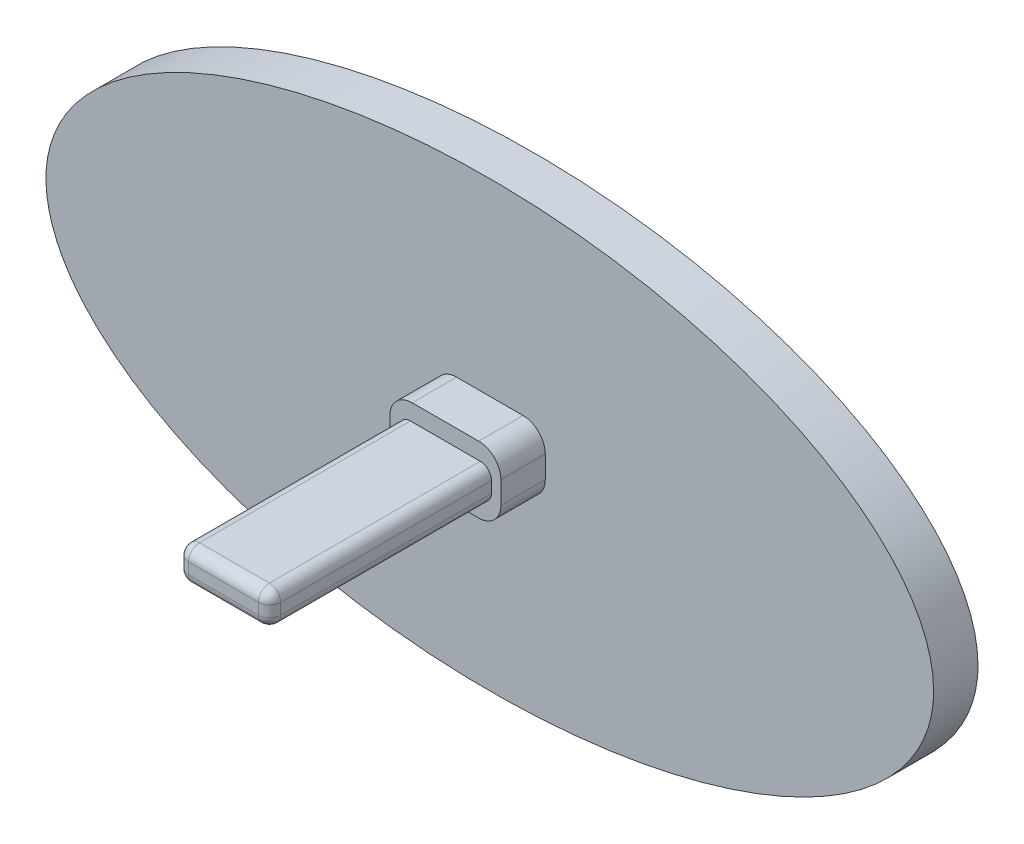
ISO-10303-21;
HEADER;
FILE_DESCRIPTION(('STEP AP214'),'2;1');
FILE_NAME('part.step','',(''),(''),'','','');
FILE_SCHEMA(('AUTOMOTIVE_DESIGN { 1 0 10303 214 1 1 1 1 }'));
ENDSEC;
DATA;
#1=APPLICATION_CONTEXT('core data for automotive mechanical design processes');
#2=APPLICATION_PROTOCOL_DEFINITION('international standard','automotive_design',2000,#1);
#3=PRODUCT_CONTEXT('',#1,'mechanical');
#4=PRODUCT('Part','Part','',(#3));
#5=PRODUCT_RELATED_PRODUCT_CATEGORY('part','',(#4));
#6=PRODUCT_DEFINITION_FORMATION('','',#4);
#7=PRODUCT_DEFINITION_CONTEXT('part definition',#1,'design');
#8=PRODUCT_DEFINITION('design','',#6,#7);
#9=PRODUCT_DEFINITION_SHAPE('','',#8);
#10=(LENGTH_UNIT() NAMED_UNIT(*) SI_UNIT(.MILLI.,.METRE.));
#11=(NAMED_UNIT(*) PLANE_ANGLE_UNIT() SI_UNIT($,.RADIAN.));
#12=(NAMED_UNIT(*) SI_UNIT($,.STERADIAN.) SOLID_ANGLE_UNIT());
#13=UNCERTAINTY_MEASURE_WITH_UNIT(LENGTH_MEASURE(1.E-05),#10,'distance_accuracy_value','');
#14=(GEOMETRIC_REPRESENTATION_CONTEXT(3) GLOBAL_UNCERTAINTY_ASSIGNED_CONTEXT((#13)) GLOBAL_UNIT_ASSIGNED_CONTEXT((#10,
#11,#12)) REPRESENTATION_CONTEXT('',''));
#15=CARTESIAN_POINT('',(0.,0.,0.));
#16=DIRECTION('',(0.,0.,1.));
#17=DIRECTION('',(1.,0.,0.));
#18=AXIS2_PLACEMENT_3D('',#15,#16,#17);
#19=CARTESIAN_POINT('',(-2.5,-1.5,4.));
#20=DIRECTION('',(0.,0.,1.));
#21=DIRECTION('',(1.,0.,0.));
#22=AXIS2_PLACEMENT_3D('',#19,#20,#21);
#23=PLANE('',#22);
#24=DIRECTION('',(1.,0.,0.));
#25=VECTOR('',#24,1.);
#26=CARTESIAN_POINT('',(-2.5,1.5,4.));
#27=LINE('',#26,#25);
#28=CARTESIAN_POINT('',(-1.5,1.5,4.));
#29=VERTEX_POINT('',#28);
#30=CARTESIAN_POINT('',(1.5,1.5,4.));
#31=VERTEX_POINT('',#30);
#32=EDGE_CURVE('E178',#29,#31,#27,.T.);
#33=ORIENTED_EDGE('',*,*,#32,.F.);
#34=CARTESIAN_POINT('',(-1.5,0.5,4.));
#35=DIRECTION('',(0.,0.,1.));
#36=DIRECTION('',(1.,0.,0.));
#37=AXIS2_PLACEMENT_3D('',#34,#35,#36);
#38=CIRCLE('',#37,1.);
#39=CARTESIAN_POINT('',(-2.5,0.5,4.));
#40=VERTEX_POINT('',#39);
#41=EDGE_CURVE('E160',#29,#40,#38,.T.);
#42=ORIENTED_EDGE('',*,*,#41,.T.);
#43=DIRECTION('',(0.,1.,0.));
#44=VECTOR('',#43,1.);
#45=CARTESIAN_POINT('',(-2.5,-1.5,4.));
#46=LINE('',#45,#44);
#47=CARTESIAN_POINT('',(-2.5,-0.5,4.));
#48=VERTEX_POINT('',#47);
#49=EDGE_CURVE('E202',#48,#40,#46,.T.);
#50=ORIENTED_EDGE('',*,*,#49,.F.);
#51=CARTESIAN_POINT('',(-1.5,-0.5,4.));
#52=DIRECTION('',(0.,0.,1.));
#53=DIRECTION('',(1.,0.,0.));
#54=AXIS2_PLACEMENT_3D('',#51,#52,#53);
#55=CIRCLE('',#54,1.);
#56=CARTESIAN_POINT('',(-1.5,-1.5,4.));
#57=VERTEX_POINT('',#56);
#58=EDGE_CURVE('E182',#48,#57,#55,.T.);
#59=ORIENTED_EDGE('',*,*,#58,.T.);
#60=DIRECTION('',(1.,0.,0.));
#61=VECTOR('',#60,1.);
#62=CARTESIAN_POINT('',(-2.5,-1.5,4.));
#63=LINE('',#62,#61);
#64=CARTESIAN_POINT('',(1.5,-1.5,4.));
#65=VERTEX_POINT('',#64);
#66=EDGE_CURVE('E190',#57,#65,#63,.T.);
#67=ORIENTED_EDGE('',*,*,#66,.T.);
#68=CARTESIAN_POINT('',(1.5,-0.5,4.));
#69=DIRECTION('',(0.,0.,1.));
#70=DIRECTION('',(1.,0.,0.));
#71=AXIS2_PLACEMENT_3D('',#68,#69,#70);
#72=CIRCLE('',#71,1.);
#73=CARTESIAN_POINT('',(2.5,-0.5,4.));
#74=VERTEX_POINT('',#73);
#75=EDGE_CURVE('E469',#65,#74,#72,.T.);
#76=ORIENTED_EDGE('',*,*,#75,.T.);
#77=DIRECTION('',(0.,1.,0.));
#78=VECTOR('',#77,1.);
#79=CARTESIAN_POINT('',(2.5,-1.5,4.));
#80=LINE('',#79,#78);
#81=CARTESIAN_POINT('',(2.5,0.5,4.));
#82=VERTEX_POINT('',#81);
#83=EDGE_CURVE('E210',#74,#82,#80,.T.);
#84=ORIENTED_EDGE('',*,*,#83,.T.);
#85=CARTESIAN_POINT('',(1.5,0.5,4.));
#86=DIRECTION('',(0.,0.,1.));
#87=DIRECTION('',(1.,0.,0.));
#88=AXIS2_PLACEMENT_3D('',#85,#86,#87);
#89=CIRCLE('',#88,1.);
#90=EDGE_CURVE('E171',#82,#31,#89,.T.);
#91=ORIENTED_EDGE('',*,*,#90,.T.);
#92=EDGE_LOOP('',(#33,#42,#50,#59,#67,#76,#84,#91));
#93=FACE_BOUND('',#92,.T.);
#94=DIRECTION('',(1.,0.,0.));
#95=VECTOR('',#94,1.);
#96=CARTESIAN_POINT('',(-2.075,-0.75,4.));
#97=LINE('',#96,#95);
#98=CARTESIAN_POINT('',(-1.575,-0.75,4.));
#99=VERTEX_POINT('',#98);
#100=CARTESIAN_POINT('',(1.575,-0.75,4.));
#101=VERTEX_POINT('',#100);
#102=EDGE_CURVE('E408',#99,#101,#97,.T.);
#103=ORIENTED_EDGE('',*,*,#102,.F.);
#104=CARTESIAN_POINT('',(-1.575,-0.25,4.));
#105=DIRECTION('',(0.,0.,1.));
#106=DIRECTION('',(1.,0.,0.));
#107=AXIS2_PLACEMENT_3D('',#104,#105,#106);
#108=CIRCLE('',#107,0.5);
#109=CARTESIAN_POINT('',(-2.075,-0.25,4.));
#110=VERTEX_POINT('',#109);
#111=EDGE_CURVE('E11',#99,#110,#108,.F.);
#112=ORIENTED_EDGE('',*,*,#111,.T.);
#113=DIRECTION('',(0.,-1.,0.));
#114=VECTOR('',#113,1.);
#115=CARTESIAN_POINT('',(-2.075,0.75,4.));
#116=LINE('',#115,#114);
#117=CARTESIAN_POINT('',(-2.075,0.25,4.));
#118=VERTEX_POINT('',#117);
#119=EDGE_CURVE('E405',#118,#110,#116,.T.);
#120=ORIENTED_EDGE('',*,*,#119,.F.);
#121=CARTESIAN_POINT('',(-1.575,0.25,4.));
#122=DIRECTION('',(0.,0.,1.));
#123=DIRECTION('',(1.,0.,0.));
#124=AXIS2_PLACEMENT_3D('',#121,#122,#123);
#125=CIRCLE('',#124,0.5);
#126=CARTESIAN_POINT('',(-1.575,0.75,4.));
#127=VERTEX_POINT('',#126);
#128=EDGE_CURVE('E44',#118,#127,#125,.F.);
#129=ORIENTED_EDGE('',*,*,#128,.T.);
#130=DIRECTION('',(-1.,0.,0.));
#131=VECTOR('',#130,1.);
#132=CARTESIAN_POINT('',(-2.075,0.75,4.));
#133=LINE('',#132,#131);
#134=CARTESIAN_POINT('',(1.575,0.75,4.));
#135=VERTEX_POINT('',#134);
#136=EDGE_CURVE('E188',#135,#127,#133,.T.);
#137=ORIENTED_EDGE('',*,*,#136,.F.);
#138=CARTESIAN_POINT('',(1.575,0.25,4.));
#139=DIRECTION('',(0.,0.,1.));
#140=DIRECTION('',(1.,0.,0.));
#141=AXIS2_PLACEMENT_3D('',#138,#139,#140);
#142=CIRCLE('',#141,0.5);
#143=CARTESIAN_POINT('',(2.075,0.25,4.));
#144=VERTEX_POINT('',#143);
#145=EDGE_CURVE('E368',#135,#144,#142,.F.);
#146=ORIENTED_EDGE('',*,*,#145,.T.);
#147=DIRECTION('',(0.,1.,0.));
#148=VECTOR('',#147,1.);
#149=CARTESIAN_POINT('',(2.075,0.75,4.));
#150=LINE('',#149,#148);
#151=CARTESIAN_POINT('',(2.075,-0.25,4.));
#152=VERTEX_POINT('',#151);
#153=EDGE_CURVE('E193',#152,#144,#150,.T.);
#154=ORIENTED_EDGE('',*,*,#153,.F.);
#155=CARTESIAN_POINT('',(1.575,-0.25,4.));
#156=DIRECTION('',(0.,0.,1.));
#157=DIRECTION('',(1.,0.,0.));
#158=AXIS2_PLACEMENT_3D('',#155,#156,#157);
#159=CIRCLE('',#158,0.5);
#160=EDGE_CURVE('E370',#152,#101,#159,.F.);
#161=ORIENTED_EDGE('',*,*,#160,.T.);
#162=EDGE_LOOP('',(#103,#112,#120,#129,#137,#146,#154,#161));
#163=FACE_BOUND('',#162,.T.);
#164=ADVANCED_FACE('F35',(#93,#163),#23,.T.);
#165=CARTESIAN_POINT('',(0.,0.,2.));
#166=DIRECTION('',(0.,0.,1.));
#167=DIRECTION('',(1.,0.,0.));
#168=AXIS2_PLACEMENT_3D('',#165,#166,#167);
#169=ELLIPSE('',#168,20.,10.);
#170=DIRECTION('',(0.,0.,-1.));
#171=VECTOR('',#170,1.);
#172=SURFACE_OF_LINEAR_EXTRUSION('',#169,#171);
#173=CARTESIAN_POINT('',(20.,0.,2.));
#174=VERTEX_POINT('',#173);
#175=EDGE_CURVE('E213',#174,#174,#169,.T.);
#176=ORIENTED_EDGE('',*,*,#175,.F.);
#177=EDGE_LOOP('',(#176));
#178=FACE_BOUND('',#177,.T.);
#179=CARTESIAN_POINT('',(0.,0.,0.));
#180=DIRECTION('',(0.,0.,1.));
#181=DIRECTION('',(1.,0.,0.));
#182=AXIS2_PLACEMENT_3D('',#179,#180,#181);
#183=ELLIPSE('',#182,20.,10.);
#184=CARTESIAN_POINT('',(20.,0.,0.));
#185=VERTEX_POINT('',#184);
#186=EDGE_CURVE('E206',#185,#185,#183,.T.);
#187=ORIENTED_EDGE('',*,*,#186,.T.);
#188=EDGE_LOOP('',(#187));
#189=FACE_BOUND('',#188,.T.);
#190=ADVANCED_FACE('F219',(#178,#189),#172,.F.);
#191=CARTESIAN_POINT('',(0.,0.,2.));
#192=DIRECTION('',(0.,0.,1.));
#193=DIRECTION('',(1.,0.,0.));
#194=AXIS2_PLACEMENT_3D('',#191,#192,#193);
#195=PLANE('',#194);
#196=DIRECTION('',(0.,1.,0.));
#197=VECTOR('',#196,1.);
#198=CARTESIAN_POINT('',(2.5,-1.5,2.));
#199=LINE('',#198,#197);
#200=CARTESIAN_POINT('',(2.5,-0.5,2.));
#201=VERTEX_POINT('',#200);
#202=CARTESIAN_POINT('',(2.5,0.5,2.));
#203=VERTEX_POINT('',#202);
#204=EDGE_CURVE('E207',#201,#203,#199,.T.);
#205=ORIENTED_EDGE('',*,*,#204,.F.);
#206=CARTESIAN_POINT('',(1.5,-0.5,2.));
#207=DIRECTION('',(0.,0.,1.));
#208=DIRECTION('',(1.,0.,0.));
#209=AXIS2_PLACEMENT_3D('',#206,#207,#208);
#210=CIRCLE('',#209,1.);
#211=CARTESIAN_POINT('',(1.5,-1.5,2.));
#212=VERTEX_POINT('',#211);
#213=EDGE_CURVE('E312',#201,#212,#210,.F.);
#214=ORIENTED_EDGE('',*,*,#213,.T.);
#215=DIRECTION('',(-1.,0.,0.));
#216=VECTOR('',#215,1.);
#217=CARTESIAN_POINT('',(-2.5,-1.5,2.));
#218=LINE('',#217,#216);
#219=CARTESIAN_POINT('',(-1.5,-1.5,2.));
#220=VERTEX_POINT('',#219);
#221=EDGE_CURVE('E199',#212,#220,#218,.T.);
#222=ORIENTED_EDGE('',*,*,#221,.T.);
#223=CARTESIAN_POINT('',(-1.5,-0.5,2.));
#224=DIRECTION('',(0.,0.,1.));
#225=DIRECTION('',(1.,0.,0.));
#226=AXIS2_PLACEMENT_3D('',#223,#224,#225);
#227=CIRCLE('',#226,1.);
#228=CARTESIAN_POINT('',(-2.5,-0.5,2.));
#229=VERTEX_POINT('',#228);
#230=EDGE_CURVE('E334',#220,#229,#227,.F.);
#231=ORIENTED_EDGE('',*,*,#230,.T.);
#232=DIRECTION('',(0.,1.,0.));
#233=VECTOR('',#232,1.);
#234=CARTESIAN_POINT('',(-2.5,-1.5,2.));
#235=LINE('',#234,#233);
#236=CARTESIAN_POINT('',(-2.5,0.5,2.));
#237=VERTEX_POINT('',#236);
#238=EDGE_CURVE('E203',#229,#237,#235,.T.);
#239=ORIENTED_EDGE('',*,*,#238,.T.);
#240=CARTESIAN_POINT('',(-1.5,0.5,2.));
#241=DIRECTION('',(0.,0.,1.));
#242=DIRECTION('',(1.,0.,0.));
#243=AXIS2_PLACEMENT_3D('',#240,#241,#242);
#244=CIRCLE('',#243,1.);
#245=CARTESIAN_POINT('',(-1.5,1.5,2.));
#246=VERTEX_POINT('',#245);
#247=EDGE_CURVE('E330',#237,#246,#244,.F.);
#248=ORIENTED_EDGE('',*,*,#247,.T.);
#249=DIRECTION('',(-1.,0.,0.));
#250=VECTOR('',#249,1.);
#251=CARTESIAN_POINT('',(-2.5,1.5,2.));
#252=LINE('',#251,#250);
#253=CARTESIAN_POINT('',(1.5,1.5,2.));
#254=VERTEX_POINT('',#253);
#255=EDGE_CURVE('E181',#254,#246,#252,.T.);
#256=ORIENTED_EDGE('',*,*,#255,.F.);
#257=CARTESIAN_POINT('',(1.5,0.5,2.));
#258=DIRECTION('',(0.,0.,1.));
#259=DIRECTION('',(1.,0.,0.));
#260=AXIS2_PLACEMENT_3D('',#257,#258,#259);
#261=CIRCLE('',#260,1.);
#262=EDGE_CURVE('E314',#254,#203,#261,.F.);
#263=ORIENTED_EDGE('',*,*,#262,.T.);
#264=EDGE_LOOP('',(#205,#214,#222,#231,#239,#248,#256,#263));
#265=FACE_BOUND('',#264,.T.);
#266=ORIENTED_EDGE('',*,*,#175,.T.);
#267=EDGE_LOOP('',(#266));
#268=FACE_BOUND('',#267,.T.);
#269=ADVANCED_FACE('F223',(#265,#268),#195,.T.);
#270=CARTESIAN_POINT('',(0.,0.,0.));
#271=DIRECTION('',(0.,0.,1.));
#272=DIRECTION('',(1.,0.,0.));
#273=AXIS2_PLACEMENT_3D('',#270,#271,#272);
#274=PLANE('',#273);
#275=ORIENTED_EDGE('',*,*,#186,.F.);
#276=EDGE_LOOP('',(#275));
#277=FACE_BOUND('',#276,.T.);
#278=ADVANCED_FACE('F225',(#277),#274,.F.);
#279=CARTESIAN_POINT('',(-2.5,-1.5,4.));
#280=DIRECTION('',(-1.,0.,0.));
#281=DIRECTION('',(0.,0.,1.));
#282=AXIS2_PLACEMENT_3D('',#279,#280,#281);
#283=PLANE('',#282);
#284=ORIENTED_EDGE('',*,*,#49,.T.);
#285=DIRECTION('',(0.,0.,1.));
#286=VECTOR('',#285,1.);
#287=CARTESIAN_POINT('',(-2.5,0.5,2.));
#288=LINE('',#287,#286);
#289=EDGE_CURVE('E165',#40,#237,#288,.F.);
#290=ORIENTED_EDGE('',*,*,#289,.T.);
#291=ORIENTED_EDGE('',*,*,#238,.F.);
#292=DIRECTION('',(0.,0.,1.));
#293=VECTOR('',#292,1.);
#294=CARTESIAN_POINT('',(-2.5,-0.5,4.));
#295=LINE('',#294,#293);
#296=EDGE_CURVE('E170',#229,#48,#295,.T.);
#297=ORIENTED_EDGE('',*,*,#296,.T.);
#298=EDGE_LOOP('',(#284,#290,#291,#297));
#299=FACE_BOUND('',#298,.T.);
#300=ADVANCED_FACE('F297',(#299),#283,.T.);
#301=CARTESIAN_POINT('',(2.5,-1.5,4.));
#302=DIRECTION('',(1.,0.,0.));
#303=DIRECTION('',(0.,0.,-1.));
#304=AXIS2_PLACEMENT_3D('',#301,#302,#303);
#305=PLANE('',#304);
#306=ORIENTED_EDGE('',*,*,#204,.T.);
#307=DIRECTION('',(0.,0.,-1.));
#308=VECTOR('',#307,1.);
#309=CARTESIAN_POINT('',(2.5,0.5,4.));
#310=LINE('',#309,#308);
#311=EDGE_CURVE('E319',#203,#82,#310,.F.);
#312=ORIENTED_EDGE('',*,*,#311,.T.);
#313=ORIENTED_EDGE('',*,*,#83,.F.);
#314=DIRECTION('',(0.,0.,-1.));
#315=VECTOR('',#314,1.);
#316=CARTESIAN_POINT('',(2.5,-0.5,4.));
#317=LINE('',#316,#315);
#318=EDGE_CURVE('E321',#74,#201,#317,.T.);
#319=ORIENTED_EDGE('',*,*,#318,.T.);
#320=EDGE_LOOP('',(#306,#312,#313,#319));
#321=FACE_BOUND('',#320,.T.);
#322=ADVANCED_FACE('F295',(#321),#305,.T.);
#323=CARTESIAN_POINT('',(0.,-1.5,0.));
#324=DIRECTION('',(0.,-1.,0.));
#325=DIRECTION('',(0.,0.,-1.));
#326=AXIS2_PLACEMENT_3D('',#323,#324,#325);
#327=PLANE('',#326);
#328=ORIENTED_EDGE('',*,*,#221,.F.);
#329=DIRECTION('',(0.,0.,-1.));
#330=VECTOR('',#329,1.);
#331=CARTESIAN_POINT('',(1.5,-1.5,0.));
#332=LINE('',#331,#330);
#333=EDGE_CURVE('E324',#212,#65,#332,.F.);
#334=ORIENTED_EDGE('',*,*,#333,.T.);
#335=ORIENTED_EDGE('',*,*,#66,.F.);
#336=DIRECTION('',(0.,0.,1.));
#337=VECTOR('',#336,1.);
#338=CARTESIAN_POINT('',(-1.5,-1.5,0.));
#339=LINE('',#338,#337);
#340=EDGE_CURVE('E322',#57,#220,#339,.F.);
#341=ORIENTED_EDGE('',*,*,#340,.T.);
#342=EDGE_LOOP('',(#328,#334,#335,#341));
#343=FACE_BOUND('',#342,.T.);
#344=ADVANCED_FACE('F456',(#343),#327,.T.);
#345=CARTESIAN_POINT('',(0.,1.5,0.));
#346=DIRECTION('',(0.,-1.,0.));
#347=DIRECTION('',(0.,0.,-1.));
#348=AXIS2_PLACEMENT_3D('',#345,#346,#347);
#349=PLANE('',#348);
#350=ORIENTED_EDGE('',*,*,#255,.T.);
#351=DIRECTION('',(0.,0.,1.));
#352=VECTOR('',#351,1.);
#353=CARTESIAN_POINT('',(-1.5,1.5,4.));
#354=LINE('',#353,#352);
#355=EDGE_CURVE('E164',#246,#29,#354,.T.);
#356=ORIENTED_EDGE('',*,*,#355,.T.);
#357=ORIENTED_EDGE('',*,*,#32,.T.);
#358=DIRECTION('',(0.,0.,-1.));
#359=VECTOR('',#358,1.);
#360=CARTESIAN_POINT('',(1.5,1.5,2.));
#361=LINE('',#360,#359);
#362=EDGE_CURVE('E183',#31,#254,#361,.T.);
#363=ORIENTED_EDGE('',*,*,#362,.T.);
#364=EDGE_LOOP('',(#350,#356,#357,#363));
#365=FACE_BOUND('',#364,.T.);
#366=ADVANCED_FACE('F176',(#365),#349,.F.);
#367=CARTESIAN_POINT('',(-2.075,0.75,14.));
#368=DIRECTION('',(1.,0.,0.));
#369=DIRECTION('',(0.,0.,-1.));
#370=AXIS2_PLACEMENT_3D('',#367,#368,#369);
#371=PLANE('',#370);
#372=DIRECTION('',(0.,-1.,0.));
#373=VECTOR('',#372,1.);
#374=CARTESIAN_POINT('',(-2.075,0.75,13.5));
#375=LINE('',#374,#373);
#376=CARTESIAN_POINT('',(-2.075,-0.25,13.5));
#377=VERTEX_POINT('',#376);
#378=CARTESIAN_POINT('',(-2.075,0.25,13.5));
#379=VERTEX_POINT('',#378);
#380=EDGE_CURVE('E354',#377,#379,#375,.F.);
#381=ORIENTED_EDGE('',*,*,#380,.T.);
#382=DIRECTION('',(0.,0.,-1.));
#383=VECTOR('',#382,1.);
#384=CARTESIAN_POINT('',(-2.075,0.25,14.));
#385=LINE('',#384,#383);
#386=EDGE_CURVE('E356',#379,#118,#385,.T.);
#387=ORIENTED_EDGE('',*,*,#386,.T.);
#388=ORIENTED_EDGE('',*,*,#119,.T.);
#389=DIRECTION('',(0.,0.,-1.));
#390=VECTOR('',#389,1.);
#391=CARTESIAN_POINT('',(-2.075,-0.25,14.));
#392=LINE('',#391,#390);
#393=EDGE_CURVE('E352',#110,#377,#392,.F.);
#394=ORIENTED_EDGE('',*,*,#393,.T.);
#395=EDGE_LOOP('',(#381,#387,#388,#394));
#396=FACE_BOUND('',#395,.T.);
#397=ADVANCED_FACE('F448',(#396),#371,.F.);
#398=CARTESIAN_POINT('',(-2.075,-0.75,14.));
#399=DIRECTION('',(0.,1.,0.));
#400=DIRECTION('',(0.,0.,1.));
#401=AXIS2_PLACEMENT_3D('',#398,#399,#400);
#402=PLANE('',#401);
#403=ORIENTED_EDGE('',*,*,#102,.T.);
#404=DIRECTION('',(0.,0.,-1.));
#405=VECTOR('',#404,1.);
#406=CARTESIAN_POINT('',(1.575,-0.75,14.));
#407=LINE('',#406,#405);
#408=CARTESIAN_POINT('',(1.575,-0.75,13.5));
#409=VERTEX_POINT('',#408);
#410=EDGE_CURVE('E362',#101,#409,#407,.F.);
#411=ORIENTED_EDGE('',*,*,#410,.T.);
#412=DIRECTION('',(1.,0.,0.));
#413=VECTOR('',#412,1.);
#414=CARTESIAN_POINT('',(-2.075,-0.75,13.5));
#415=LINE('',#414,#413);
#416=CARTESIAN_POINT('',(-1.575,-0.75,13.5));
#417=VERTEX_POINT('',#416);
#418=EDGE_CURVE('E360',#409,#417,#415,.F.);
#419=ORIENTED_EDGE('',*,*,#418,.T.);
#420=DIRECTION('',(0.,0.,-1.));
#421=VECTOR('',#420,1.);
#422=CARTESIAN_POINT('',(-1.575,-0.75,14.));
#423=LINE('',#422,#421);
#424=EDGE_CURVE('E358',#417,#99,#423,.T.);
#425=ORIENTED_EDGE('',*,*,#424,.T.);
#426=EDGE_LOOP('',(#403,#411,#419,#425));
#427=FACE_BOUND('',#426,.T.);
#428=ADVANCED_FACE('F434',(#427),#402,.F.);
#429=CARTESIAN_POINT('',(2.075,0.75,14.));
#430=DIRECTION('',(-1.,0.,0.));
#431=DIRECTION('',(0.,0.,1.));
#432=AXIS2_PLACEMENT_3D('',#429,#430,#431);
#433=PLANE('',#432);
#434=ORIENTED_EDGE('',*,*,#153,.T.);
#435=DIRECTION('',(0.,0.,-1.));
#436=VECTOR('',#435,1.);
#437=CARTESIAN_POINT('',(2.075,0.25,14.));
#438=LINE('',#437,#436);
#439=CARTESIAN_POINT('',(2.075,0.25,13.5));
#440=VERTEX_POINT('',#439);
#441=EDGE_CURVE('E52',#144,#440,#438,.F.);
#442=ORIENTED_EDGE('',*,*,#441,.T.);
#443=DIRECTION('',(0.,1.,0.));
#444=VECTOR('',#443,1.);
#445=CARTESIAN_POINT('',(2.075,-0.75,13.5));
#446=LINE('',#445,#444);
#447=CARTESIAN_POINT('',(2.075,-0.25,13.5));
#448=VERTEX_POINT('',#447);
#449=EDGE_CURVE('E56',#440,#448,#446,.F.);
#450=ORIENTED_EDGE('',*,*,#449,.T.);
#451=DIRECTION('',(0.,0.,-1.));
#452=VECTOR('',#451,1.);
#453=CARTESIAN_POINT('',(2.075,-0.25,14.));
#454=LINE('',#453,#452);
#455=EDGE_CURVE('E364',#448,#152,#454,.T.);
#456=ORIENTED_EDGE('',*,*,#455,.T.);
#457=EDGE_LOOP('',(#434,#442,#450,#456));
#458=FACE_BOUND('',#457,.T.);
#459=ADVANCED_FACE('F416',(#458),#433,.F.);
#460=CARTESIAN_POINT('',(-2.075,0.75,14.));
#461=DIRECTION('',(0.,-1.,0.));
#462=DIRECTION('',(0.,0.,-1.));
#463=AXIS2_PLACEMENT_3D('',#460,#461,#462);
#464=PLANE('',#463);
#465=DIRECTION('',(-1.,0.,0.));
#466=VECTOR('',#465,1.);
#467=CARTESIAN_POINT('',(2.075,0.75,13.5));
#468=LINE('',#467,#466);
#469=CARTESIAN_POINT('',(-1.575,0.75,13.5));
#470=VERTEX_POINT('',#469);
#471=CARTESIAN_POINT('',(1.575,0.75,13.5));
#472=VERTEX_POINT('',#471);
#473=EDGE_CURVE('E347',#470,#472,#468,.F.);
#474=ORIENTED_EDGE('',*,*,#473,.T.);
#475=DIRECTION('',(0.,0.,-1.));
#476=VECTOR('',#475,1.);
#477=CARTESIAN_POINT('',(1.575,0.75,14.));
#478=LINE('',#477,#476);
#479=EDGE_CURVE('E350',#472,#135,#478,.T.);
#480=ORIENTED_EDGE('',*,*,#479,.T.);
#481=ORIENTED_EDGE('',*,*,#136,.T.);
#482=DIRECTION('',(0.,0.,-1.));
#483=VECTOR('',#482,1.);
#484=CARTESIAN_POINT('',(-1.575,0.75,14.));
#485=LINE('',#484,#483);
#486=EDGE_CURVE('E345',#127,#470,#485,.F.);
#487=ORIENTED_EDGE('',*,*,#486,.T.);
#488=EDGE_LOOP('',(#474,#480,#481,#487));
#489=FACE_BOUND('',#488,.T.);
#490=ADVANCED_FACE('F445',(#489),#464,.F.);
#491=CARTESIAN_POINT('',(0.,0.,14.));
#492=DIRECTION('',(0.,0.,1.));
#493=DIRECTION('',(1.,0.,0.));
#494=AXIS2_PLACEMENT_3D('',#491,#492,#493);
#495=PLANE('',#494);
#496=DIRECTION('',(0.,1.,0.));
#497=VECTOR('',#496,1.);
#498=CARTESIAN_POINT('',(1.575,0.75,14.));
#499=LINE('',#498,#497);
#500=CARTESIAN_POINT('',(1.575,-0.25,14.));
#501=VERTEX_POINT('',#500);
#502=CARTESIAN_POINT('',(1.575,0.25,14.));
#503=VERTEX_POINT('',#502);
#504=EDGE_CURVE('E336',#501,#503,#499,.T.);
#505=ORIENTED_EDGE('',*,*,#504,.T.);
#506=DIRECTION('',(-1.,0.,0.));
#507=VECTOR('',#506,1.);
#508=CARTESIAN_POINT('',(-2.075,0.25,14.));
#509=LINE('',#508,#507);
#510=CARTESIAN_POINT('',(-1.575,0.25,14.));
#511=VERTEX_POINT('',#510);
#512=EDGE_CURVE('E342',#503,#511,#509,.T.);
#513=ORIENTED_EDGE('',*,*,#512,.T.);
#514=DIRECTION('',(0.,-1.,0.));
#515=VECTOR('',#514,1.);
#516=CARTESIAN_POINT('',(-1.575,-0.75,14.));
#517=LINE('',#516,#515);
#518=CARTESIAN_POINT('',(-1.575,-0.25,14.));
#519=VERTEX_POINT('',#518);
#520=EDGE_CURVE('E340',#511,#519,#517,.T.);
#521=ORIENTED_EDGE('',*,*,#520,.T.);
#522=DIRECTION('',(1.,0.,0.));
#523=VECTOR('',#522,1.);
#524=CARTESIAN_POINT('',(2.075,-0.25,14.));
#525=LINE('',#524,#523);
#526=EDGE_CURVE('E338',#519,#501,#525,.T.);
#527=ORIENTED_EDGE('',*,*,#526,.T.);
#528=EDGE_LOOP('',(#505,#513,#521,#527));
#529=FACE_BOUND('',#528,.T.);
#530=ADVANCED_FACE('F230',(#529),#495,.T.);
#531=CARTESIAN_POINT('',(-1.5,0.5,0.));
#532=DIRECTION('',(0.,0.,-1.));
#533=DIRECTION('',(-1.,0.,0.));
#534=AXIS2_PLACEMENT_3D('',#531,#532,#533);
#535=CYLINDRICAL_SURFACE('',#534,1.);
#536=ORIENTED_EDGE('',*,*,#247,.F.);
#537=ORIENTED_EDGE('',*,*,#289,.F.);
#538=ORIENTED_EDGE('',*,*,#41,.F.);
#539=ORIENTED_EDGE('',*,*,#355,.F.);
#540=EDGE_LOOP('',(#536,#537,#538,#539));
#541=FACE_BOUND('',#540,.T.);
#542=ADVANCED_FACE('F163',(#541),#535,.T.);
#543=CARTESIAN_POINT('',(1.5,0.5,0.));
#544=DIRECTION('',(0.,0.,1.));
#545=DIRECTION('',(1.,0.,0.));
#546=AXIS2_PLACEMENT_3D('',#543,#544,#545);
#547=CYLINDRICAL_SURFACE('',#546,1.);
#548=ORIENTED_EDGE('',*,*,#90,.F.);
#549=ORIENTED_EDGE('',*,*,#311,.F.);
#550=ORIENTED_EDGE('',*,*,#262,.F.);
#551=ORIENTED_EDGE('',*,*,#362,.F.);
#552=EDGE_LOOP('',(#548,#549,#550,#551));
#553=FACE_BOUND('',#552,.T.);
#554=ADVANCED_FACE('F229',(#553),#547,.T.);
#555=CARTESIAN_POINT('',(1.5,-0.5,4.));
#556=DIRECTION('',(0.,0.,-1.));
#557=DIRECTION('',(-1.,0.,0.));
#558=AXIS2_PLACEMENT_3D('',#555,#556,#557);
#559=CYLINDRICAL_SURFACE('',#558,1.);
#560=ORIENTED_EDGE('',*,*,#75,.F.);
#561=ORIENTED_EDGE('',*,*,#333,.F.);
#562=ORIENTED_EDGE('',*,*,#213,.F.);
#563=ORIENTED_EDGE('',*,*,#318,.F.);
#564=EDGE_LOOP('',(#560,#561,#562,#563));
#565=FACE_BOUND('',#564,.T.);
#566=ADVANCED_FACE('F233',(#565),#559,.T.);
#567=CARTESIAN_POINT('',(-1.5,-0.5,4.));
#568=DIRECTION('',(0.,0.,1.));
#569=DIRECTION('',(1.,0.,0.));
#570=AXIS2_PLACEMENT_3D('',#567,#568,#569);
#571=CYLINDRICAL_SURFACE('',#570,1.);
#572=ORIENTED_EDGE('',*,*,#230,.F.);
#573=ORIENTED_EDGE('',*,*,#340,.F.);
#574=ORIENTED_EDGE('',*,*,#58,.F.);
#575=ORIENTED_EDGE('',*,*,#296,.F.);
#576=EDGE_LOOP('',(#572,#573,#574,#575));
#577=FACE_BOUND('',#576,.T.);
#578=ADVANCED_FACE('F237',(#577),#571,.T.);
#579=CARTESIAN_POINT('',(1.575,-0.25,14.));
#580=DIRECTION('',(0.,0.,-1.));
#581=DIRECTION('',(-1.,0.,0.));
#582=AXIS2_PLACEMENT_3D('',#579,#580,#581);
#583=CYLINDRICAL_SURFACE('',#582,0.5);
#584=ORIENTED_EDGE('',*,*,#160,.F.);
#585=ORIENTED_EDGE('',*,*,#455,.F.);
#586=CARTESIAN_POINT('',(1.575,-0.25,13.5));
#587=DIRECTION('',(0.,0.,1.));
#588=DIRECTION('',(1.,0.,0.));
#589=AXIS2_PLACEMENT_3D('',#586,#587,#588);
#590=CIRCLE('',#589,0.5);
#591=EDGE_CURVE('E39',#409,#448,#590,.T.);
#592=ORIENTED_EDGE('',*,*,#591,.F.);
#593=ORIENTED_EDGE('',*,*,#410,.F.);
#594=EDGE_LOOP('',(#584,#585,#592,#593));
#595=FACE_BOUND('',#594,.T.);
#596=ADVANCED_FACE('F37',(#595),#583,.T.);
#597=CARTESIAN_POINT('',(0.,-0.25,13.5));
#598=DIRECTION('',(-1.,0.,0.));
#599=DIRECTION('',(0.,0.,1.));
#600=AXIS2_PLACEMENT_3D('',#597,#598,#599);
#601=CYLINDRICAL_SURFACE('',#600,0.5);
#602=CARTESIAN_POINT('',(-1.575,-0.25,13.5));
#603=DIRECTION('',(-1.,0.,0.));
#604=DIRECTION('',(0.,0.,1.));
#605=AXIS2_PLACEMENT_3D('',#602,#603,#604);
#606=CIRCLE('',#605,0.5);
#607=EDGE_CURVE('E398',#417,#519,#606,.T.);
#608=ORIENTED_EDGE('',*,*,#607,.F.);
#609=ORIENTED_EDGE('',*,*,#418,.F.);
#610=CARTESIAN_POINT('',(1.575,-0.25,13.5));
#611=DIRECTION('',(1.,0.,0.));
#612=DIRECTION('',(0.,0.,-1.));
#613=AXIS2_PLACEMENT_3D('',#610,#611,#612);
#614=CIRCLE('',#613,0.5);
#615=EDGE_CURVE('E400',#501,#409,#614,.T.);
#616=ORIENTED_EDGE('',*,*,#615,.F.);
#617=ORIENTED_EDGE('',*,*,#526,.F.);
#618=EDGE_LOOP('',(#608,#609,#616,#617));
#619=FACE_BOUND('',#618,.T.);
#620=ADVANCED_FACE('F280',(#619),#601,.T.);
#621=CARTESIAN_POINT('',(-1.575,-0.25,14.));
#622=DIRECTION('',(0.,0.,-1.));
#623=DIRECTION('',(-1.,0.,0.));
#624=AXIS2_PLACEMENT_3D('',#621,#622,#623);
#625=CYLINDRICAL_SURFACE('',#624,0.5);
#626=ORIENTED_EDGE('',*,*,#111,.F.);
#627=ORIENTED_EDGE('',*,*,#424,.F.);
#628=CARTESIAN_POINT('',(-1.575,-0.25,13.5));
#629=DIRECTION('',(0.,0.,1.));
#630=DIRECTION('',(1.,0.,0.));
#631=AXIS2_PLACEMENT_3D('',#628,#629,#630);
#632=CIRCLE('',#631,0.5);
#633=EDGE_CURVE('E395',#377,#417,#632,.T.);
#634=ORIENTED_EDGE('',*,*,#633,.F.);
#635=ORIENTED_EDGE('',*,*,#393,.F.);
#636=EDGE_LOOP('',(#626,#627,#634,#635));
#637=FACE_BOUND('',#636,.T.);
#638=ADVANCED_FACE('F277',(#637),#625,.T.);
#639=CARTESIAN_POINT('',(1.575,-0.25,13.5));
#640=DIRECTION('',(0.,0.,1.));
#641=DIRECTION('',(1.,0.,0.));
#642=AXIS2_PLACEMENT_3D('',#639,#640,#641);
#643=SPHERICAL_SURFACE('',#642,0.5);
#644=ORIENTED_EDGE('',*,*,#615,.T.);
#645=ORIENTED_EDGE('',*,*,#591,.T.);
#646=CARTESIAN_POINT('',(1.575,-0.25,13.5));
#647=DIRECTION('',(0.,-1.,0.));
#648=DIRECTION('',(0.,0.,-1.));
#649=AXIS2_PLACEMENT_3D('',#646,#647,#648);
#650=CIRCLE('',#649,0.5);
#651=EDGE_CURVE('E392',#501,#448,#650,.F.);
#652=ORIENTED_EDGE('',*,*,#651,.F.);
#653=EDGE_LOOP('',(#644,#645,#652));
#654=FACE_BOUND('',#653,.T.);
#655=ADVANCED_FACE('F273',(#654),#643,.T.);
#656=CARTESIAN_POINT('',(-1.575,-0.25,13.5));
#657=DIRECTION('',(0.,0.,1.));
#658=DIRECTION('',(1.,0.,0.));
#659=AXIS2_PLACEMENT_3D('',#656,#657,#658);
#660=SPHERICAL_SURFACE('',#659,0.5);
#661=ORIENTED_EDGE('',*,*,#633,.T.);
#662=ORIENTED_EDGE('',*,*,#607,.T.);
#663=CARTESIAN_POINT('',(-1.575,-0.25,13.5));
#664=DIRECTION('',(0.,-1.,0.));
#665=DIRECTION('',(0.,0.,-1.));
#666=AXIS2_PLACEMENT_3D('',#663,#664,#665);
#667=CIRCLE('',#666,0.5);
#668=EDGE_CURVE('E389',#377,#519,#667,.F.);
#669=ORIENTED_EDGE('',*,*,#668,.F.);
#670=EDGE_LOOP('',(#661,#662,#669));
#671=FACE_BOUND('',#670,.T.);
#672=ADVANCED_FACE('F269',(#671),#660,.T.);
#673=CARTESIAN_POINT('',(1.575,0.25,14.));
#674=DIRECTION('',(0.,0.,-1.));
#675=DIRECTION('',(-1.,0.,0.));
#676=AXIS2_PLACEMENT_3D('',#673,#674,#675);
#677=CYLINDRICAL_SURFACE('',#676,0.5);
#678=ORIENTED_EDGE('',*,*,#145,.F.);
#679=ORIENTED_EDGE('',*,*,#479,.F.);
#680=CARTESIAN_POINT('',(1.575,0.25,13.5));
#681=DIRECTION('',(0.,0.,1.));
#682=DIRECTION('',(1.,0.,0.));
#683=AXIS2_PLACEMENT_3D('',#680,#681,#682);
#684=CIRCLE('',#683,0.5);
#685=EDGE_CURVE('E386',#440,#472,#684,.T.);
#686=ORIENTED_EDGE('',*,*,#685,.F.);
#687=ORIENTED_EDGE('',*,*,#441,.F.);
#688=EDGE_LOOP('',(#678,#679,#686,#687));
#689=FACE_BOUND('',#688,.T.);
#690=ADVANCED_FACE('F265',(#689),#677,.T.);
#691=CARTESIAN_POINT('',(1.575,0.,13.5));
#692=DIRECTION('',(0.,-1.,0.));
#693=DIRECTION('',(0.,0.,-1.));
#694=AXIS2_PLACEMENT_3D('',#691,#692,#693);
#695=CYLINDRICAL_SURFACE('',#694,0.5);
#696=ORIENTED_EDGE('',*,*,#651,.T.);
#697=ORIENTED_EDGE('',*,*,#449,.F.);
#698=CARTESIAN_POINT('',(1.575,0.25,13.5));
#699=DIRECTION('',(0.,1.,0.));
#700=DIRECTION('',(0.,0.,1.));
#701=AXIS2_PLACEMENT_3D('',#698,#699,#700);
#702=CIRCLE('',#701,0.5);
#703=EDGE_CURVE('E383',#503,#440,#702,.T.);
#704=ORIENTED_EDGE('',*,*,#703,.F.);
#705=ORIENTED_EDGE('',*,*,#504,.F.);
#706=EDGE_LOOP('',(#696,#697,#704,#705));
#707=FACE_BOUND('',#706,.T.);
#708=ADVANCED_FACE('F261',(#707),#695,.T.);
#709=CARTESIAN_POINT('',(-1.575,0.,13.5));
#710=DIRECTION('',(0.,1.,0.));
#711=DIRECTION('',(0.,0.,1.));
#712=AXIS2_PLACEMENT_3D('',#709,#710,#711);
#713=CYLINDRICAL_SURFACE('',#712,0.5);
#714=ORIENTED_EDGE('',*,*,#668,.T.);
#715=ORIENTED_EDGE('',*,*,#520,.F.);
#716=CARTESIAN_POINT('',(-1.575,0.25,13.5));
#717=DIRECTION('',(0.,1.,0.));
#718=DIRECTION('',(0.,0.,1.));
#719=AXIS2_PLACEMENT_3D('',#716,#717,#718);
#720=CIRCLE('',#719,0.5);
#721=EDGE_CURVE('E380',#379,#511,#720,.T.);
#722=ORIENTED_EDGE('',*,*,#721,.F.);
#723=ORIENTED_EDGE('',*,*,#380,.F.);
#724=EDGE_LOOP('',(#714,#715,#722,#723));
#725=FACE_BOUND('',#724,.T.);
#726=ADVANCED_FACE('F257',(#725),#713,.T.);
#727=CARTESIAN_POINT('',(-1.575,0.25,14.));
#728=DIRECTION('',(0.,0.,-1.));
#729=DIRECTION('',(-1.,0.,0.));
#730=AXIS2_PLACEMENT_3D('',#727,#728,#729);
#731=CYLINDRICAL_SURFACE('',#730,0.5);
#732=ORIENTED_EDGE('',*,*,#128,.F.);
#733=ORIENTED_EDGE('',*,*,#386,.F.);
#734=CARTESIAN_POINT('',(-1.575,0.25,13.5));
#735=DIRECTION('',(0.,0.,1.));
#736=DIRECTION('',(1.,0.,0.));
#737=AXIS2_PLACEMENT_3D('',#734,#735,#736);
#738=CIRCLE('',#737,0.5);
#739=EDGE_CURVE('E377',#470,#379,#738,.T.);
#740=ORIENTED_EDGE('',*,*,#739,.F.);
#741=ORIENTED_EDGE('',*,*,#486,.F.);
#742=EDGE_LOOP('',(#732,#733,#740,#741));
#743=FACE_BOUND('',#742,.T.);
#744=ADVANCED_FACE('F253',(#743),#731,.T.);
#745=CARTESIAN_POINT('',(1.575,0.25,13.5));
#746=DIRECTION('',(0.,0.,1.));
#747=DIRECTION('',(1.,0.,0.));
#748=AXIS2_PLACEMENT_3D('',#745,#746,#747);
#749=SPHERICAL_SURFACE('',#748,0.5);
#750=ORIENTED_EDGE('',*,*,#703,.T.);
#751=ORIENTED_EDGE('',*,*,#685,.T.);
#752=CARTESIAN_POINT('',(1.575,0.25,13.5));
#753=DIRECTION('',(1.,0.,0.));
#754=DIRECTION('',(0.,0.,-1.));
#755=AXIS2_PLACEMENT_3D('',#752,#753,#754);
#756=CIRCLE('',#755,0.5);
#757=EDGE_CURVE('E375',#503,#472,#756,.F.);
#758=ORIENTED_EDGE('',*,*,#757,.F.);
#759=EDGE_LOOP('',(#750,#751,#758));
#760=FACE_BOUND('',#759,.T.);
#761=ADVANCED_FACE('F249',(#760),#749,.T.);
#762=CARTESIAN_POINT('',(-1.575,0.25,13.5));
#763=DIRECTION('',(0.,0.,1.));
#764=DIRECTION('',(1.,0.,0.));
#765=AXIS2_PLACEMENT_3D('',#762,#763,#764);
#766=SPHERICAL_SURFACE('',#765,0.5);
#767=ORIENTED_EDGE('',*,*,#739,.T.);
#768=ORIENTED_EDGE('',*,*,#721,.T.);
#769=CARTESIAN_POINT('',(-1.575,0.25,13.5));
#770=DIRECTION('',(-1.,0.,0.));
#771=DIRECTION('',(0.,0.,1.));
#772=AXIS2_PLACEMENT_3D('',#769,#770,#771);
#773=CIRCLE('',#772,0.5);
#774=EDGE_CURVE('E373',#470,#511,#773,.F.);
#775=ORIENTED_EDGE('',*,*,#774,.F.);
#776=EDGE_LOOP('',(#767,#768,#775));
#777=FACE_BOUND('',#776,.T.);
#778=ADVANCED_FACE('F245',(#777),#766,.T.);
#779=CARTESIAN_POINT('',(0.,0.25,13.5));
#780=DIRECTION('',(1.,0.,0.));
#781=DIRECTION('',(0.,0.,-1.));
#782=AXIS2_PLACEMENT_3D('',#779,#780,#781);
#783=CYLINDRICAL_SURFACE('',#782,0.5);
#784=ORIENTED_EDGE('',*,*,#757,.T.);
#785=ORIENTED_EDGE('',*,*,#473,.F.);
#786=ORIENTED_EDGE('',*,*,#774,.T.);
#787=ORIENTED_EDGE('',*,*,#512,.F.);
#788=EDGE_LOOP('',(#784,#785,#786,#787));
#789=FACE_BOUND('',#788,.T.);
#790=ADVANCED_FACE('F242',(#789),#783,.T.);
#791=CLOSED_SHELL('',(#164,#190,#269,#278,#300,#322,#344,#366,#397,#428,#459,#490,#530,#542,
#554,#566,#578,#596,#620,#638,#655,#672,#690,#708,#726,#744,#761,#778,#790));
#792=MANIFOLD_SOLID_BREP('B2',#791);
#793=ADVANCED_BREP_SHAPE_REPRESENTATION('',(#18,#792),#14);
#794=SHAPE_DEFINITION_REPRESENTATION(#9,#793);
ENDSEC;
END-ISO-10303-21;
